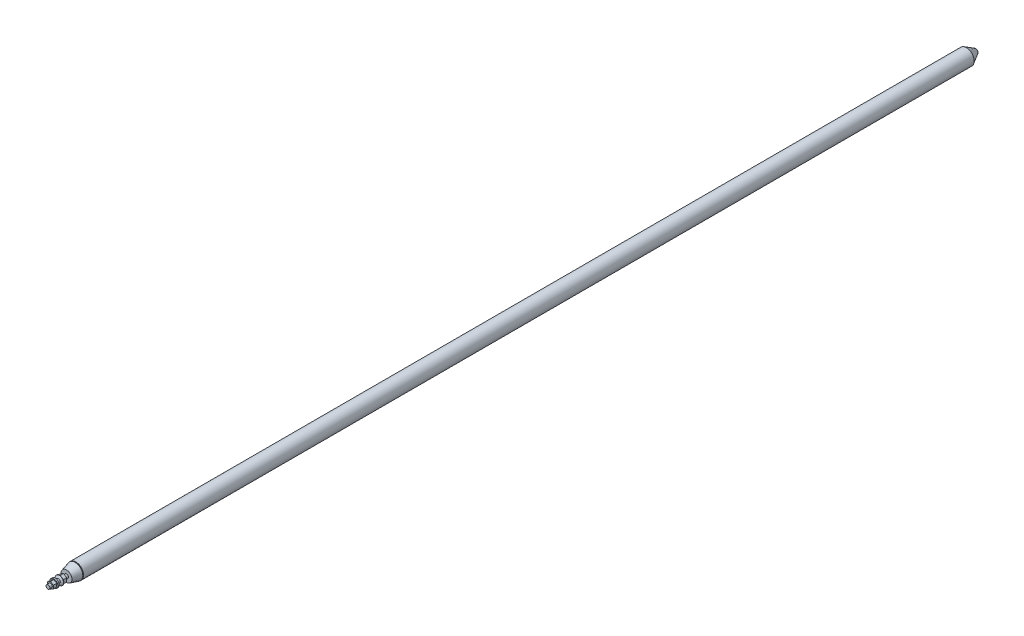
ISO-10303-21;
HEADER;
FILE_DESCRIPTION(('STEP AP214'),'2;1');
FILE_NAME('part.step','',(''),(''),'','','');
FILE_SCHEMA(('AUTOMOTIVE_DESIGN { 1 0 10303 214 1 1 1 1 }'));
ENDSEC;
DATA;
#1=APPLICATION_CONTEXT('core data for automotive mechanical design processes');
#2=APPLICATION_PROTOCOL_DEFINITION('international standard','automotive_design',2000,#1);
#3=PRODUCT_CONTEXT('',#1,'mechanical');
#4=PRODUCT('Part','Part','',(#3));
#5=PRODUCT_RELATED_PRODUCT_CATEGORY('part','',(#4));
#6=PRODUCT_DEFINITION_FORMATION('','',#4);
#7=PRODUCT_DEFINITION_CONTEXT('part definition',#1,'design');
#8=PRODUCT_DEFINITION('design','',#6,#7);
#9=PRODUCT_DEFINITION_SHAPE('','',#8);
#10=(LENGTH_UNIT() NAMED_UNIT(*) SI_UNIT(.MILLI.,.METRE.));
#11=(NAMED_UNIT(*) PLANE_ANGLE_UNIT() SI_UNIT($,.RADIAN.));
#12=(NAMED_UNIT(*) SI_UNIT($,.STERADIAN.) SOLID_ANGLE_UNIT());
#13=UNCERTAINTY_MEASURE_WITH_UNIT(LENGTH_MEASURE(1.E-05),#10,'distance_accuracy_value','');
#14=(GEOMETRIC_REPRESENTATION_CONTEXT(3) GLOBAL_UNCERTAINTY_ASSIGNED_CONTEXT((#13)) GLOBAL_UNIT_ASSIGNED_CONTEXT((#10,
#11,#12)) REPRESENTATION_CONTEXT('',''));
#15=CARTESIAN_POINT('',(0.,0.,0.));
#16=DIRECTION('',(0.,0.,1.));
#17=DIRECTION('',(1.,0.,0.));
#18=AXIS2_PLACEMENT_3D('',#15,#16,#17);
#19=CARTESIAN_POINT('',(0.,16.6751,52.1089983991226));
#20=DIRECTION('',(0.,0.,1.));
#21=DIRECTION('',(1.,0.,0.));
#22=AXIS2_PLACEMENT_3D('',#19,#20,#21);
#23=PLANE('',#22);
#24=CARTESIAN_POINT('',(0.,0.,52.1089983991226));
#25=DIRECTION('',(0.,0.,-1.));
#26=DIRECTION('',(-1.,0.,0.));
#27=AXIS2_PLACEMENT_3D('',#24,#25,#26);
#28=CIRCLE('',#27,16.6751);
#29=CARTESIAN_POINT('',(-16.6751,0.,52.1089983991226));
#30=VERTEX_POINT('',#29);
#31=EDGE_CURVE('E149',#30,#30,#28,.T.);
#32=ORIENTED_EDGE('',*,*,#31,.F.);
#33=EDGE_LOOP('',(#32));
#34=FACE_BOUND('',#33,.T.);
#35=DIRECTION('',(0.866025403784438,0.5,0.));
#36=VECTOR('',#35,1.);
#37=CARTESIAN_POINT('',(0.,-13.7554856334967,52.1089983991226));
#38=LINE('',#37,#36);
#39=CARTESIAN_POINT('',(0.,-13.7554856334967,52.1089983991226));
#40=VERTEX_POINT('',#39);
#41=CARTESIAN_POINT('',(11.9126,-6.87774281674833,52.1089983991226));
#42=VERTEX_POINT('',#41);
#43=EDGE_CURVE('E626',#40,#42,#38,.T.);
#44=ORIENTED_EDGE('',*,*,#43,.F.);
#45=DIRECTION('',(0.866025403784439,-0.499999999999999,0.));
#46=VECTOR('',#45,1.);
#47=CARTESIAN_POINT('',(-11.9126,-6.87774281674834,52.1089983991226));
#48=LINE('',#47,#46);
#49=CARTESIAN_POINT('',(-11.9126,-6.87774281674834,52.1089983991226));
#50=VERTEX_POINT('',#49);
#51=EDGE_CURVE('E147',#50,#40,#48,.T.);
#52=ORIENTED_EDGE('',*,*,#51,.F.);
#53=DIRECTION('',(0.,-1.,0.));
#54=VECTOR('',#53,1.);
#55=CARTESIAN_POINT('',(-11.9126,6.87774281674833,52.1089983991226));
#56=LINE('',#55,#54);
#57=CARTESIAN_POINT('',(-11.9126,6.87774281674833,52.1089983991226));
#58=VERTEX_POINT('',#57);
#59=EDGE_CURVE('E143',#58,#50,#56,.T.);
#60=ORIENTED_EDGE('',*,*,#59,.F.);
#61=DIRECTION('',(-0.866025403784439,-0.5,0.));
#62=VECTOR('',#61,1.);
#63=CARTESIAN_POINT('',(0.,13.7554856334967,52.1089983991226));
#64=LINE('',#63,#62);
#65=CARTESIAN_POINT('',(0.,13.7554856334967,52.1089983991226));
#66=VERTEX_POINT('',#65);
#67=EDGE_CURVE('E622',#66,#58,#64,.T.);
#68=ORIENTED_EDGE('',*,*,#67,.F.);
#69=DIRECTION('',(-0.866025403784439,0.5,0.));
#70=VECTOR('',#69,1.);
#71=CARTESIAN_POINT('',(11.9126,6.87774281674833,52.1089983991226));
#72=LINE('',#71,#70);
#73=CARTESIAN_POINT('',(11.9126,6.87774281674833,52.1089983991226));
#74=VERTEX_POINT('',#73);
#75=EDGE_CURVE('E634',#74,#66,#72,.T.);
#76=ORIENTED_EDGE('',*,*,#75,.F.);
#77=DIRECTION('',(0.,1.,0.));
#78=VECTOR('',#77,1.);
#79=CARTESIAN_POINT('',(11.9126,-6.87774281674833,52.1089983991226));
#80=LINE('',#79,#78);
#81=EDGE_CURVE('E628',#42,#74,#80,.T.);
#82=ORIENTED_EDGE('',*,*,#81,.F.);
#83=EDGE_LOOP('',(#44,#52,#60,#68,#76,#82));
#84=FACE_BOUND('',#83,.T.);
#85=ADVANCED_FACE('F33',(#34,#84),#23,.T.);
#86=CARTESIAN_POINT('',(0.,0.,0.));
#87=DIRECTION('',(0.,0.,-1.));
#88=DIRECTION('',(-1.,0.,0.));
#89=AXIS2_PLACEMENT_3D('',#86,#87,#88);
#90=CYLINDRICAL_SURFACE('',#89,7.93749999999999);
#91=CARTESIAN_POINT('',(0.,0.,46.2923983991226));
#92=DIRECTION('',(0.,0.,-1.));
#93=DIRECTION('',(-1.,0.,0.));
#94=AXIS2_PLACEMENT_3D('',#91,#92,#93);
#95=CIRCLE('',#94,7.93749999999999);
#96=CARTESIAN_POINT('',(-7.93749999999999,0.,46.2923983991226));
#97=VERTEX_POINT('',#96);
#98=EDGE_CURVE('E42',#97,#97,#95,.F.);
#99=ORIENTED_EDGE('',*,*,#98,.F.);
#100=EDGE_LOOP('',(#99));
#101=FACE_BOUND('',#100,.T.);
#102=CARTESIAN_POINT('',(0.,0.,33.5923983991226));
#103=DIRECTION('',(0.,0.,-1.));
#104=DIRECTION('',(-1.,0.,0.));
#105=AXIS2_PLACEMENT_3D('',#102,#103,#104);
#106=CIRCLE('',#105,7.93749999999999);
#107=CARTESIAN_POINT('',(0.,7.93749999999996,33.5923983991227));
#108=VERTEX_POINT('',#107);
#109=EDGE_CURVE('E236',#108,#108,#106,.T.);
#110=ORIENTED_EDGE('',*,*,#109,.F.);
#111=EDGE_LOOP('',(#110));
#112=FACE_BOUND('',#111,.T.);
#113=ADVANCED_FACE('F248',(#101,#112),#90,.T.);
#114=CARTESIAN_POINT('',(0.,0.,0.));
#115=DIRECTION('',(0.,0.,-1.));
#116=DIRECTION('',(-1.,0.,0.));
#117=AXIS2_PLACEMENT_3D('',#114,#115,#116);
#118=CIRCLE('',#117,7.93749999999999);
#119=CARTESIAN_POINT('',(-7.93749999999999,0.,0.));
#120=VERTEX_POINT('',#119);
#121=EDGE_CURVE('E224',#120,#120,#118,.T.);
#122=ORIENTED_EDGE('',*,*,#121,.F.);
#123=EDGE_LOOP('',(#122));
#124=FACE_BOUND('',#123,.T.);
#125=CARTESIAN_POINT('',(0.,0.,12.690475));
#126=DIRECTION('',(0.,0.,1.));
#127=DIRECTION('',(1.,0.,0.));
#128=AXIS2_PLACEMENT_3D('',#125,#126,#127);
#129=CIRCLE('',#128,7.93749999999999);
#130=CARTESIAN_POINT('',(7.93749999999999,0.,12.690475));
#131=VERTEX_POINT('',#130);
#132=EDGE_CURVE('E201',#131,#131,#129,.F.);
#133=ORIENTED_EDGE('',*,*,#132,.T.);
#134=EDGE_LOOP('',(#133));
#135=FACE_BOUND('',#134,.T.);
#136=ADVANCED_FACE('F251',(#124,#135),#90,.T.);
#137=CARTESIAN_POINT('',(0.,0.,-38.1));
#138=DIRECTION('',(0.,0.,1.));
#139=DIRECTION('',(1.,0.,0.));
#140=AXIS2_PLACEMENT_3D('',#137,#138,#139);
#141=CONICAL_SURFACE('',#140,28.575,0.780728808749583);
#142=CARTESIAN_POINT('',(0.,0.,-34.8952102827305));
#143=DIRECTION('',(0.,0.,-1.));
#144=DIRECTION('',(-1.,0.,0.));
#145=AXIS2_PLACEMENT_3D('',#142,#143,#144);
#146=CIRCLE('',#145,31.75);
#147=CARTESIAN_POINT('',(-31.75,0.,-34.8952102827305));
#148=VERTEX_POINT('',#147);
#149=EDGE_CURVE('E230',#148,#148,#146,.T.);
#150=ORIENTED_EDGE('',*,*,#149,.T.);
#151=EDGE_LOOP('',(#150));
#152=FACE_BOUND('',#151,.T.);
#153=CARTESIAN_POINT('',(0.,0.,-38.1));
#154=DIRECTION('',(0.,0.,-1.));
#155=DIRECTION('',(-1.,0.,0.));
#156=AXIS2_PLACEMENT_3D('',#153,#154,#155);
#157=CIRCLE('',#156,28.575);
#158=CARTESIAN_POINT('',(-28.575,0.,-38.1));
#159=VERTEX_POINT('',#158);
#160=EDGE_CURVE('E233',#159,#159,#157,.T.);
#161=ORIENTED_EDGE('',*,*,#160,.F.);
#162=EDGE_LOOP('',(#161));
#163=FACE_BOUND('',#162,.T.);
#164=ADVANCED_FACE('F454',(#152,#163),#141,.T.);
#165=CARTESIAN_POINT('',(0.,0.,-34.8952102827305));
#166=DIRECTION('',(0.,0.,-1.));
#167=DIRECTION('',(-1.,0.,0.));
#168=AXIS2_PLACEMENT_3D('',#165,#166,#167);
#169=CONICAL_SURFACE('',#168,31.75,0.266468742447018);
#170=CARTESIAN_POINT('',(0.,0.,0.));
#171=DIRECTION('',(0.,0.,-1.));
#172=DIRECTION('',(-1.,0.,0.));
#173=AXIS2_PLACEMENT_3D('',#170,#171,#172);
#174=CIRCLE('',#173,22.225);
#175=CARTESIAN_POINT('',(-22.225,0.,0.));
#176=VERTEX_POINT('',#175);
#177=EDGE_CURVE('E227',#176,#176,#174,.T.);
#178=ORIENTED_EDGE('',*,*,#177,.T.);
#179=EDGE_LOOP('',(#178));
#180=FACE_BOUND('',#179,.T.);
#181=ORIENTED_EDGE('',*,*,#149,.F.);
#182=EDGE_LOOP('',(#181));
#183=FACE_BOUND('',#182,.T.);
#184=ADVANCED_FACE('F540',(#180,#183),#169,.T.);
#185=CARTESIAN_POINT('',(0.,7.93749999999999,0.));
#186=DIRECTION('',(0.,0.,1.));
#187=DIRECTION('',(1.,0.,0.));
#188=AXIS2_PLACEMENT_3D('',#185,#186,#187);
#189=PLANE('',#188);
#190=ORIENTED_EDGE('',*,*,#121,.T.);
#191=EDGE_LOOP('',(#190));
#192=FACE_BOUND('',#191,.T.);
#193=ORIENTED_EDGE('',*,*,#177,.F.);
#194=EDGE_LOOP('',(#193));
#195=FACE_BOUND('',#194,.T.);
#196=ADVANCED_FACE('F527',(#192,#195),#189,.T.);
#197=CARTESIAN_POINT('',(0.,31.75,-38.1));
#198=DIRECTION('',(0.,0.,-1.));
#199=DIRECTION('',(-1.,0.,0.));
#200=AXIS2_PLACEMENT_3D('',#197,#198,#199);
#201=PLANE('',#200);
#202=ORIENTED_EDGE('',*,*,#160,.T.);
#203=EDGE_LOOP('',(#202));
#204=FACE_BOUND('',#203,.T.);
#205=CARTESIAN_POINT('',(0.,0.,-38.1));
#206=DIRECTION('',(0.,0.,1.));
#207=DIRECTION('',(1.,0.,0.));
#208=AXIS2_PLACEMENT_3D('',#205,#206,#207);
#209=CIRCLE('',#208,31.75);
#210=CARTESIAN_POINT('',(31.75,0.,-38.1));
#211=VERTEX_POINT('',#210);
#212=EDGE_CURVE('E205',#211,#211,#209,.T.);
#213=ORIENTED_EDGE('',*,*,#212,.T.);
#214=EDGE_LOOP('',(#213));
#215=FACE_BOUND('',#214,.T.);
#216=ADVANCED_FACE('F523',(#204,#215),#201,.F.);
#217=CARTESIAN_POINT('',(0.,0.,29.7434));
#218=DIRECTION('',(0.,0.,1.));
#219=DIRECTION('',(1.,0.,0.));
#220=AXIS2_PLACEMENT_3D('',#217,#218,#219);
#221=CYLINDRICAL_SURFACE('',#220,31.75);
#222=ORIENTED_EDGE('',*,*,#212,.F.);
#223=EDGE_LOOP('',(#222));
#224=FACE_BOUND('',#223,.T.);
#225=CARTESIAN_POINT('',(0.,0.,-3688.58124758295));
#226=DIRECTION('',(0.,0.,1.));
#227=DIRECTION('',(1.,0.,0.));
#228=AXIS2_PLACEMENT_3D('',#225,#226,#227);
#229=CIRCLE('',#228,31.75);
#230=CARTESIAN_POINT('',(31.75,0.,-3688.58124758295));
#231=VERTEX_POINT('',#230);
#232=EDGE_CURVE('E208',#231,#231,#229,.T.);
#233=ORIENTED_EDGE('',*,*,#232,.T.);
#234=EDGE_LOOP('',(#233));
#235=FACE_BOUND('',#234,.T.);
#236=ADVANCED_FACE('F526',(#224,#235),#221,.T.);
#237=CARTESIAN_POINT('',(0.,0.,-3724.52386072327));
#238=DIRECTION('',(0.,0.,1.));
#239=DIRECTION('',(1.,0.,0.));
#240=AXIS2_PLACEMENT_3D('',#237,#238,#239);
#241=CONICAL_SURFACE('',#240,10.9985226280624,0.523598775598293);
#242=ORIENTED_EDGE('',*,*,#232,.F.);
#243=EDGE_LOOP('',(#242));
#244=FACE_BOUND('',#243,.T.);
#245=CARTESIAN_POINT('',(0.,0.,-3724.52386072327));
#246=DIRECTION('',(0.,0.,1.));
#247=DIRECTION('',(1.,0.,0.));
#248=AXIS2_PLACEMENT_3D('',#245,#246,#247);
#249=CIRCLE('',#248,10.9985226280624);
#250=CARTESIAN_POINT('',(10.9985226280624,0.,-3724.52386072327));
#251=VERTEX_POINT('',#250);
#252=EDGE_CURVE('E211',#251,#251,#249,.T.);
#253=ORIENTED_EDGE('',*,*,#252,.T.);
#254=EDGE_LOOP('',(#253));
#255=FACE_BOUND('',#254,.T.);
#256=ADVANCED_FACE('F531',(#244,#255),#241,.T.);
#257=CARTESIAN_POINT('',(0.,0.,-3718.17386072327));
#258=DIRECTION('',(0.,0.,1.));
#259=DIRECTION('',(0.,1.,0.));
#260=AXIS2_PLACEMENT_3D('',#257,#258,#259);
#261=SPHERICAL_SURFACE('',#260,12.7000000000001);
#262=ORIENTED_EDGE('',*,*,#252,.F.);
#263=EDGE_LOOP('',(#262));
#264=FACE_BOUND('',#263,.T.);
#265=ADVANCED_FACE('F464',(#264),#261,.T.);
#266=CARTESIAN_POINT('',(13.5001,-7.79428636908687,12.690475));
#267=DIRECTION('',(-0.499999999999999,0.866025403784439,0.));
#268=DIRECTION('',(-0.866025403784439,-0.5,0.));
#269=AXIS2_PLACEMENT_3D('',#266,#267,#268);
#270=PLANE('',#269);
#271=DIRECTION('',(-0.866025403784439,-0.499999999999999,0.));
#272=VECTOR('',#271,1.);
#273=CARTESIAN_POINT('',(13.5001,-7.79428636908687,28.1686));
#274=LINE('',#273,#272);
#275=CARTESIAN_POINT('',(13.5001,-7.79428636908687,28.1686));
#276=VERTEX_POINT('',#275);
#277=CARTESIAN_POINT('',(0.,-15.5885727381737,28.1686));
#278=VERTEX_POINT('',#277);
#279=EDGE_CURVE('E160',#276,#278,#274,.T.);
#280=ORIENTED_EDGE('',*,*,#279,.T.);
#281=DIRECTION('',(0.,0.,1.));
#282=VECTOR('',#281,1.);
#283=CARTESIAN_POINT('',(0.,-15.5885727381737,12.690475));
#284=LINE('',#283,#282);
#285=CARTESIAN_POINT('',(0.,-15.5885727381737,12.690475));
#286=VERTEX_POINT('',#285);
#287=EDGE_CURVE('E199',#286,#278,#284,.T.);
#288=ORIENTED_EDGE('',*,*,#287,.F.);
#289=DIRECTION('',(-0.866025403784439,-0.499999999999999,0.));
#290=VECTOR('',#289,1.);
#291=CARTESIAN_POINT('',(13.5001,-7.79428636908687,12.690475));
#292=LINE('',#291,#290);
#293=CARTESIAN_POINT('',(13.5001,-7.79428636908687,12.690475));
#294=VERTEX_POINT('',#293);
#295=EDGE_CURVE('E161',#294,#286,#292,.T.);
#296=ORIENTED_EDGE('',*,*,#295,.F.);
#297=DIRECTION('',(0.,0.,1.));
#298=VECTOR('',#297,1.);
#299=CARTESIAN_POINT('',(13.5001,-7.79428636908687,12.690475));
#300=LINE('',#299,#298);
#301=EDGE_CURVE('E175',#294,#276,#300,.T.);
#302=ORIENTED_EDGE('',*,*,#301,.T.);
#303=EDGE_LOOP('',(#280,#288,#296,#302));
#304=FACE_BOUND('',#303,.T.);
#305=ADVANCED_FACE('F292',(#304),#270,.F.);
#306=CARTESIAN_POINT('',(0.,-15.5885727381737,12.690475));
#307=DIRECTION('',(0.5,0.866025403784438,0.));
#308=DIRECTION('',(-0.866025403784438,0.5,0.));
#309=AXIS2_PLACEMENT_3D('',#306,#307,#308);
#310=PLANE('',#309);
#311=DIRECTION('',(-0.866025403784438,0.5,0.));
#312=VECTOR('',#311,1.);
#313=CARTESIAN_POINT('',(0.,-15.5885727381737,28.1686));
#314=LINE('',#313,#312);
#315=CARTESIAN_POINT('',(-13.5001,-7.79428636908686,28.1686));
#316=VERTEX_POINT('',#315);
#317=EDGE_CURVE('E178',#278,#316,#314,.T.);
#318=ORIENTED_EDGE('',*,*,#317,.T.);
#319=DIRECTION('',(0.,0.,1.));
#320=VECTOR('',#319,1.);
#321=CARTESIAN_POINT('',(-13.5001,-7.79428636908686,12.690475));
#322=LINE('',#321,#320);
#323=CARTESIAN_POINT('',(-13.5001,-7.79428636908686,12.690475));
#324=VERTEX_POINT('',#323);
#325=EDGE_CURVE('E196',#324,#316,#322,.T.);
#326=ORIENTED_EDGE('',*,*,#325,.F.);
#327=DIRECTION('',(-0.866025403784438,0.5,0.));
#328=VECTOR('',#327,1.);
#329=CARTESIAN_POINT('',(0.,-15.5885727381737,12.690475));
#330=LINE('',#329,#328);
#331=EDGE_CURVE('E164',#286,#324,#330,.T.);
#332=ORIENTED_EDGE('',*,*,#331,.F.);
#333=ORIENTED_EDGE('',*,*,#287,.T.);
#334=EDGE_LOOP('',(#318,#326,#332,#333));
#335=FACE_BOUND('',#334,.T.);
#336=ADVANCED_FACE('F280',(#335),#310,.F.);
#337=CARTESIAN_POINT('',(-13.5001,-7.79428636908686,12.690475));
#338=DIRECTION('',(1.,0.,0.));
#339=DIRECTION('',(0.,1.,0.));
#340=AXIS2_PLACEMENT_3D('',#337,#338,#339);
#341=PLANE('',#340);
#342=DIRECTION('',(0.,1.,0.));
#343=VECTOR('',#342,1.);
#344=CARTESIAN_POINT('',(-13.5001,-7.79428636908686,28.1686));
#345=LINE('',#344,#343);
#346=CARTESIAN_POINT('',(-13.5001,7.79428636908686,28.1686));
#347=VERTEX_POINT('',#346);
#348=EDGE_CURVE('E180',#316,#347,#345,.T.);
#349=ORIENTED_EDGE('',*,*,#348,.T.);
#350=DIRECTION('',(0.,0.,1.));
#351=VECTOR('',#350,1.);
#352=CARTESIAN_POINT('',(-13.5001,7.79428636908686,12.690475));
#353=LINE('',#352,#351);
#354=CARTESIAN_POINT('',(-13.5001,7.79428636908686,12.690475));
#355=VERTEX_POINT('',#354);
#356=EDGE_CURVE('E193',#355,#347,#353,.T.);
#357=ORIENTED_EDGE('',*,*,#356,.F.);
#358=DIRECTION('',(0.,1.,0.));
#359=VECTOR('',#358,1.);
#360=CARTESIAN_POINT('',(-13.5001,-7.79428636908686,12.690475));
#361=LINE('',#360,#359);
#362=EDGE_CURVE('E167',#324,#355,#361,.T.);
#363=ORIENTED_EDGE('',*,*,#362,.F.);
#364=ORIENTED_EDGE('',*,*,#325,.T.);
#365=EDGE_LOOP('',(#349,#357,#363,#364));
#366=FACE_BOUND('',#365,.T.);
#367=ADVANCED_FACE('F284',(#366),#341,.F.);
#368=CARTESIAN_POINT('',(-13.5001,7.79428636908686,12.690475));
#369=DIRECTION('',(0.5,-0.866025403784439,0.));
#370=DIRECTION('',(0.866025403784439,0.5,0.));
#371=AXIS2_PLACEMENT_3D('',#368,#369,#370);
#372=PLANE('',#371);
#373=DIRECTION('',(0.866025403784439,0.5,0.));
#374=VECTOR('',#373,1.);
#375=CARTESIAN_POINT('',(-13.5001,7.79428636908686,28.1686));
#376=LINE('',#375,#374);
#377=CARTESIAN_POINT('',(0.,15.5885727381737,28.1686));
#378=VERTEX_POINT('',#377);
#379=EDGE_CURVE('E182',#347,#378,#376,.T.);
#380=ORIENTED_EDGE('',*,*,#379,.T.);
#381=DIRECTION('',(0.,0.,1.));
#382=VECTOR('',#381,1.);
#383=CARTESIAN_POINT('',(0.,15.5885727381737,12.690475));
#384=LINE('',#383,#382);
#385=CARTESIAN_POINT('',(0.,15.5885727381737,12.690475));
#386=VERTEX_POINT('',#385);
#387=EDGE_CURVE('E190',#386,#378,#384,.T.);
#388=ORIENTED_EDGE('',*,*,#387,.F.);
#389=DIRECTION('',(0.866025403784439,0.5,0.));
#390=VECTOR('',#389,1.);
#391=CARTESIAN_POINT('',(-13.5001,7.79428636908686,12.690475));
#392=LINE('',#391,#390);
#393=EDGE_CURVE('E169',#355,#386,#392,.T.);
#394=ORIENTED_EDGE('',*,*,#393,.F.);
#395=ORIENTED_EDGE('',*,*,#356,.T.);
#396=EDGE_LOOP('',(#380,#388,#394,#395));
#397=FACE_BOUND('',#396,.T.);
#398=ADVANCED_FACE('F299',(#397),#372,.F.);
#399=CARTESIAN_POINT('',(0.,15.5885727381737,12.690475));
#400=DIRECTION('',(-0.5,-0.866025403784438,0.));
#401=DIRECTION('',(0.866025403784439,-0.5,0.));
#402=AXIS2_PLACEMENT_3D('',#399,#400,#401);
#403=PLANE('',#402);
#404=DIRECTION('',(0.866025403784438,-0.5,0.));
#405=VECTOR('',#404,1.);
#406=CARTESIAN_POINT('',(0.,15.5885727381737,28.1686));
#407=LINE('',#406,#405);
#408=CARTESIAN_POINT('',(13.5001,7.79428636908686,28.1686));
#409=VERTEX_POINT('',#408);
#410=EDGE_CURVE('E184',#378,#409,#407,.T.);
#411=ORIENTED_EDGE('',*,*,#410,.T.);
#412=DIRECTION('',(0.,0.,1.));
#413=VECTOR('',#412,1.);
#414=CARTESIAN_POINT('',(13.5001,7.79428636908686,12.690475));
#415=LINE('',#414,#413);
#416=CARTESIAN_POINT('',(13.5001,7.79428636908686,12.690475));
#417=VERTEX_POINT('',#416);
#418=EDGE_CURVE('E57',#417,#409,#415,.T.);
#419=ORIENTED_EDGE('',*,*,#418,.F.);
#420=DIRECTION('',(0.866025403784438,-0.5,0.));
#421=VECTOR('',#420,1.);
#422=CARTESIAN_POINT('',(0.,15.5885727381737,12.690475));
#423=LINE('',#422,#421);
#424=EDGE_CURVE('E171',#386,#417,#423,.T.);
#425=ORIENTED_EDGE('',*,*,#424,.F.);
#426=ORIENTED_EDGE('',*,*,#387,.T.);
#427=EDGE_LOOP('',(#411,#419,#425,#426));
#428=FACE_BOUND('',#427,.T.);
#429=ADVANCED_FACE('F296',(#428),#403,.F.);
#430=CARTESIAN_POINT('',(13.5001,7.79428636908686,12.690475));
#431=DIRECTION('',(-1.,0.,0.));
#432=DIRECTION('',(0.,0.,1.));
#433=AXIS2_PLACEMENT_3D('',#430,#431,#432);
#434=PLANE('',#433);
#435=DIRECTION('',(0.,-1.,0.));
#436=VECTOR('',#435,1.);
#437=CARTESIAN_POINT('',(13.5001,7.79428636908686,28.1686));
#438=LINE('',#437,#436);
#439=EDGE_CURVE('E165',#409,#276,#438,.T.);
#440=ORIENTED_EDGE('',*,*,#439,.T.);
#441=ORIENTED_EDGE('',*,*,#301,.F.);
#442=DIRECTION('',(0.,-1.,0.));
#443=VECTOR('',#442,1.);
#444=CARTESIAN_POINT('',(13.5001,7.79428636908686,12.690475));
#445=LINE('',#444,#443);
#446=EDGE_CURVE('E173',#417,#294,#445,.T.);
#447=ORIENTED_EDGE('',*,*,#446,.F.);
#448=ORIENTED_EDGE('',*,*,#418,.T.);
#449=EDGE_LOOP('',(#440,#441,#447,#448));
#450=FACE_BOUND('',#449,.T.);
#451=ADVANCED_FACE('F293',(#450),#434,.F.);
#452=CARTESIAN_POINT('',(13.5001,-7.79428636908687,12.690475));
#453=DIRECTION('',(0.,0.,1.));
#454=DIRECTION('',(1.,0.,0.));
#455=AXIS2_PLACEMENT_3D('',#452,#453,#454);
#456=PLANE('',#455);
#457=ORIENTED_EDGE('',*,*,#132,.F.);
#458=EDGE_LOOP('',(#457));
#459=FACE_BOUND('',#458,.T.);
#460=ORIENTED_EDGE('',*,*,#295,.T.);
#461=ORIENTED_EDGE('',*,*,#331,.T.);
#462=ORIENTED_EDGE('',*,*,#362,.T.);
#463=ORIENTED_EDGE('',*,*,#393,.T.);
#464=ORIENTED_EDGE('',*,*,#424,.T.);
#465=ORIENTED_EDGE('',*,*,#446,.T.);
#466=EDGE_LOOP('',(#460,#461,#462,#463,#464,#465));
#467=FACE_BOUND('',#466,.T.);
#468=ADVANCED_FACE('F260',(#459,#467),#456,.F.);
#469=CARTESIAN_POINT('',(0.,0.,0.0435161764705885));
#470=DIRECTION('',(0.,0.,-1.));
#471=DIRECTION('',(0.,1.,0.));
#472=AXIS2_PLACEMENT_3D('',#469,#470,#471);
#473=SPHERICAL_SURFACE('',#472,34.4750838235294);
#474=CARTESIAN_POINT('',(0.,0.,29.7688));
#475=DIRECTION('',(0.,0.,-1.));
#476=DIRECTION('',(-1.,0.,0.));
#477=AXIS2_PLACEMENT_3D('',#474,#475,#476);
#478=CIRCLE('',#477,17.4625);
#479=CARTESIAN_POINT('',(0.,17.4625,29.7688));
#480=VERTEX_POINT('',#479);
#481=EDGE_CURVE('E215',#480,#480,#478,.T.);
#482=CARTESIAN_POINT('',(0.,7.93749999999996,33.5923983991227));
#483=CARTESIAN_POINT('',(0.,8.04193033230631,33.5676907138939));
#484=CARTESIAN_POINT('',(0.,8.14624529277318,33.5424953955937));
#485=CARTESIAN_POINT('',(0.,8.35463538983752,33.4911317569022));
#486=CARTESIAN_POINT('',(0.,8.458710526435,33.464963436511));
#487=CARTESIAN_POINT('',(0.,8.66661189557016,33.4116560576896));
#488=CARTESIAN_POINT('',(0.,8.77043812810784,33.3845169992594));
#489=CARTESIAN_POINT('',(0.,8.97783263624223,33.3292705157999));
#490=CARTESIAN_POINT('',(0.,9.08140091183892,33.3011630907704));
#491=CARTESIAN_POINT('',(0.,9.28827047420351,33.2439823239056));
#492=CARTESIAN_POINT('',(0.,9.39157176097139,33.2149089820701));
#493=CARTESIAN_POINT('',(0.,9.59789833747534,33.1557989172506));
#494=CARTESIAN_POINT('',(0.,9.7009236272114,33.1257621942665));
#495=CARTESIAN_POINT('',(0.,9.90668922540895,33.0647279863804));
#496=CARTESIAN_POINT('',(0.,10.0094295338704,33.0337305014784));
#497=CARTESIAN_POINT('',(0.,10.2146162101565,32.9707774728867));
#498=CARTESIAN_POINT('',(0.,10.3170625779811,32.938821929197));
#499=CARTESIAN_POINT('',(0.,10.521652439256,32.8739555696753));
#500=CARTESIAN_POINT('',(0.,10.6237959327063,32.8410447538433));
#501=CARTESIAN_POINT('',(0.,10.8277711379095,32.7742707199945));
#502=CARTESIAN_POINT('',(0.,10.9296028496623,32.7404075019776));
#503=CARTESIAN_POINT('',(0.,11.132945611335,32.6717316167674));
#504=CARTESIAN_POINT('',(0.,11.234456661255,32.636918949574));
#505=CARTESIAN_POINT('',(0.,11.4371492470899,32.5663472018157));
#506=CARTESIAN_POINT('',(0.,11.5383307830049,32.5305881212508));
#507=CARTESIAN_POINT('',(0.,11.7403555173927,32.458126665085));
#508=CARTESIAN_POINT('',(0.,11.8411987158655,32.4214242894841));
#509=CARTESIAN_POINT('',(0.,12.042537981436,32.3470794438415));
#510=CARTESIAN_POINT('',(0.,12.1430340485337,32.3094369737997));
#511=CARTESIAN_POINT('',(0.,12.3436702876927,32.2332152218499));
#512=CARTESIAN_POINT('',(0.,12.4438104597538,32.194635939942));
#513=CARTESIAN_POINT('',(0.,12.6437261762134,32.1165439285288));
#514=CARTESIAN_POINT('',(0.,12.7435017206118,32.0770311990235));
#515=CARTESIAN_POINT('',(0.,12.9426794809169,31.9970757380846));
#516=CARTESIAN_POINT('',(0.,13.0420816968236,31.956633006651));
#517=CARTESIAN_POINT('',(0.,13.2405041318717,31.8748210686243));
#518=CARTESIAN_POINT('',(0.,13.3395243510132,31.8334518620313));
#519=CARTESIAN_POINT('',(0.,13.5371741575694,31.7497905812473));
#520=CARTESIAN_POINT('',(0.,13.6358037449841,31.7074985070563));
#521=CARTESIAN_POINT('',(0.,13.8326636871895,31.6219951791153));
#522=CARTESIAN_POINT('',(0.,13.9308940419803,31.5787839253653));
#523=CARTESIAN_POINT('',(0.,14.1269469528556,31.4914460065018));
#524=CARTESIAN_POINT('',(0.,14.2247695089402,31.4473193413882));
#525=CARTESIAN_POINT('',(0.,14.4199982918825,31.3581544478201));
#526=CARTESIAN_POINT('',(0.,14.5174045187402,31.3131162193657));
#527=CARTESIAN_POINT('',(0.,14.7117921490136,31.2221321266308));
#528=CARTESIAN_POINT('',(0.,14.8087735524293,31.1761862623503));
#529=CARTESIAN_POINT('',(0.,15.0023030786502,31.0833909046278));
#530=CARTESIAN_POINT('',(0.,15.0988512014553,31.0365414111859));
#531=CARTESIAN_POINT('',(0.,15.2915057470694,30.9419428806036));
#532=CARTESIAN_POINT('',(0.,15.3876121698782,30.8941938434631));
#533=CARTESIAN_POINT('',(0.,15.579374934636,30.7978003893978));
#534=CARTESIAN_POINT('',(0.,15.675031276585,30.749155972473));
#535=CARTESIAN_POINT('',(0.,15.8658855379922,30.6509760008058));
#536=CARTESIAN_POINT('',(0.,15.9610834574505,30.6014404460634));
#537=CARTESIAN_POINT('',(0.,16.1510125722821,30.5014825185434));
#538=CARTESIAN_POINT('',(0.,16.2457437676554,30.4510601457658));
#539=CARTESIAN_POINT('',(0.,16.4347311731984,30.3493329789012));
#540=CARTESIAN_POINT('',(0.,16.5289873833681,30.2980281848143));
#541=CARTESIAN_POINT('',(0.,16.7170165996438,30.194540650465));
#542=CARTESIAN_POINT('',(0.,16.8107896057498,30.1423579102026));
#543=CARTESIAN_POINT('',(0.,16.9978442340481,30.0371190297578));
#544=CARTESIAN_POINT('',(0.,17.0911258562404,29.9840628895754));
#545=CARTESIAN_POINT('',(0.,17.2771895913833,29.877081852009));
#546=CARTESIAN_POINT('',(0.,17.369971704334,29.8231569546252));
#547=CARTESIAN_POINT('',(0.,17.4625,29.7688));
#548=B_SPLINE_CURVE_WITH_KNOTS('',3,(#482,#483,#484,#485,#486,#487,#488,#489,#490,#491,#492,
#493,#494,#495,#496,#497,#498,#499,#500,#501,#502,#503,#504,#505,#506,#507,#508,#509,#510,#511,
#512,#513,#514,#515,#516,#517,#518,#519,#520,#521,#522,#523,#524,#525,#526,#527,#528,#529,#530,
#531,#532,#533,#534,#535,#536,#537,#538,#539,#540,#541,#542,#543,#544,#545,#546,#547),
.UNSPECIFIED.,.F.,.F.,(4,2,2,2,2,2,2,2,2,2,2,2,2,2,2,2,2,2,2,2,2,2,2,2,2,2,2,2,2,2,2,2,4),(0.,
0.321939004572816,0.643878009145632,0.965817013718447,1.28775601829126,1.60969502286408,
1.9316340274369,2.25357303200971,2.57551203658253,2.89745104115534,3.21939004572815,
3.54132905030097,3.86326805487378,4.1852070594466,4.50714606401941,4.82908506859223,
5.15102407316505,5.47296307773786,5.79490208231068,6.11684108688349,6.43878009145631,
6.76071909602913,7.08265810060194,7.40459710517475,7.72653610974757,8.04847511432038,
8.3704141188932,8.69235312346602,9.01429212803883,9.33623113261165,9.65817013718446,
9.98010914175728,10.3020481463301),.UNSPECIFIED.);
#549=EDGE_CURVE('BSEAM256',#108,#480,#548,.T.);
#550=ORIENTED_EDGE('',*,*,#109,.T.);
#551=ORIENTED_EDGE('',*,*,#481,.F.);
#552=ORIENTED_EDGE('',*,*,#549,.T.);
#553=ORIENTED_EDGE('',*,*,#549,.F.);
#554=EDGE_LOOP('',(#550,#552,#551,#553));
#555=FACE_BOUND('',#554,.T.);
#556=ADVANCED_FACE('F256',(#555),#473,.T.);
#557=CARTESIAN_POINT('',(0.,0.,0.));
#558=DIRECTION('',(0.,0.,-1.));
#559=DIRECTION('',(-1.,0.,0.));
#560=AXIS2_PLACEMENT_3D('',#557,#558,#559);
#561=CYLINDRICAL_SURFACE('',#560,17.4625);
#562=ORIENTED_EDGE('',*,*,#481,.T.);
#563=EDGE_LOOP('',(#562));
#564=FACE_BOUND('',#563,.T.);
#565=CARTESIAN_POINT('',(0.,0.,28.1686));
#566=DIRECTION('',(0.,0.,-1.));
#567=DIRECTION('',(-1.,0.,0.));
#568=AXIS2_PLACEMENT_3D('',#565,#566,#567);
#569=CIRCLE('',#568,17.4625);
#570=CARTESIAN_POINT('',(-17.4625,0.,28.1686));
#571=VERTEX_POINT('',#570);
#572=EDGE_CURVE('E218',#571,#571,#569,.T.);
#573=ORIENTED_EDGE('',*,*,#572,.F.);
#574=EDGE_LOOP('',(#573));
#575=FACE_BOUND('',#574,.T.);
#576=ADVANCED_FACE('F259',(#564,#575),#561,.T.);
#577=CARTESIAN_POINT('',(0.,0.,28.1686));
#578=DIRECTION('',(0.,0.,-1.));
#579=DIRECTION('',(-1.,0.,0.));
#580=AXIS2_PLACEMENT_3D('',#577,#578,#579);
#581=PLANE('',#580);
#582=ORIENTED_EDGE('',*,*,#572,.T.);
#583=EDGE_LOOP('',(#582));
#584=FACE_BOUND('',#583,.T.);
#585=ORIENTED_EDGE('',*,*,#317,.F.);
#586=ORIENTED_EDGE('',*,*,#279,.F.);
#587=ORIENTED_EDGE('',*,*,#439,.F.);
#588=ORIENTED_EDGE('',*,*,#410,.F.);
#589=ORIENTED_EDGE('',*,*,#379,.F.);
#590=ORIENTED_EDGE('',*,*,#348,.F.);
#591=EDGE_LOOP('',(#585,#586,#587,#588,#589,#590));
#592=FACE_BOUND('',#591,.T.);
#593=ADVANCED_FACE('F266',(#584,#592),#581,.T.);
#594=CARTESIAN_POINT('',(0.,0.,46.2923983991226));
#595=DIRECTION('',(0.,0.,-1.));
#596=DIRECTION('',(-1.,0.,0.));
#597=AXIS2_PLACEMENT_3D('',#594,#595,#596);
#598=PLANE('',#597);
#599=ORIENTED_EDGE('',*,*,#98,.T.);
#600=EDGE_LOOP('',(#599));
#601=FACE_BOUND('',#600,.T.);
#602=CARTESIAN_POINT('',(0.,0.,46.2923983991226));
#603=DIRECTION('',(0.,0.,-1.));
#604=DIRECTION('',(-1.,0.,0.));
#605=AXIS2_PLACEMENT_3D('',#602,#603,#604);
#606=CIRCLE('',#605,16.6751);
#607=CARTESIAN_POINT('',(-16.6751,0.,46.2923983991226));
#608=VERTEX_POINT('',#607);
#609=EDGE_CURVE('E152',#608,#608,#606,.T.);
#610=ORIENTED_EDGE('',*,*,#609,.T.);
#611=EDGE_LOOP('',(#610));
#612=FACE_BOUND('',#611,.T.);
#613=ADVANCED_FACE('F245',(#601,#612),#598,.T.);
#614=CARTESIAN_POINT('',(0.,0.,0.));
#615=DIRECTION('',(0.,0.,-1.));
#616=DIRECTION('',(-1.,0.,0.));
#617=AXIS2_PLACEMENT_3D('',#614,#615,#616);
#618=CYLINDRICAL_SURFACE('',#617,16.6751);
#619=ORIENTED_EDGE('',*,*,#31,.T.);
#620=EDGE_LOOP('',(#619));
#621=FACE_BOUND('',#620,.T.);
#622=ORIENTED_EDGE('',*,*,#609,.F.);
#623=EDGE_LOOP('',(#622));
#624=FACE_BOUND('',#623,.T.);
#625=ADVANCED_FACE('F318',(#621,#624),#618,.T.);
#626=CARTESIAN_POINT('',(-11.9126,-6.87774281674834,65.9996233991226));
#627=DIRECTION('',(0.499999999999999,0.866025403784439,0.));
#628=DIRECTION('',(-0.866025403784439,0.499999999999999,0.));
#629=AXIS2_PLACEMENT_3D('',#626,#627,#628);
#630=PLANE('',#629);
#631=ORIENTED_EDGE('',*,*,#51,.T.);
#632=DIRECTION('',(0.,0.,-1.));
#633=VECTOR('',#632,1.);
#634=CARTESIAN_POINT('',(0.,-13.7554856334967,65.9996233991226));
#635=LINE('',#634,#633);
#636=CARTESIAN_POINT('',(0.,-13.7554856334967,65.9996233991226));
#637=VERTEX_POINT('',#636);
#638=EDGE_CURVE('E128',#637,#40,#635,.T.);
#639=ORIENTED_EDGE('',*,*,#638,.F.);
#640=DIRECTION('',(0.866025403784439,-0.499999999999999,0.));
#641=VECTOR('',#640,1.);
#642=CARTESIAN_POINT('',(-11.9126,-6.87774281674834,65.9996233991226));
#643=LINE('',#642,#641);
#644=CARTESIAN_POINT('',(-11.9126,-6.87774281674834,65.9996233991226));
#645=VERTEX_POINT('',#644);
#646=EDGE_CURVE('E135',#645,#637,#643,.T.);
#647=ORIENTED_EDGE('',*,*,#646,.F.);
#648=DIRECTION('',(0.,0.,-1.));
#649=VECTOR('',#648,1.);
#650=CARTESIAN_POINT('',(-11.9126,-6.87774281674834,65.9996233991226));
#651=LINE('',#650,#649);
#652=EDGE_CURVE('E620',#645,#50,#651,.T.);
#653=ORIENTED_EDGE('',*,*,#652,.T.);
#654=EDGE_LOOP('',(#631,#639,#647,#653));
#655=FACE_BOUND('',#654,.T.);
#656=ADVANCED_FACE('F145',(#655),#630,.F.);
#657=CARTESIAN_POINT('',(0.,-13.7554856334967,65.9996233991226));
#658=DIRECTION('',(-0.5,0.866025403784438,0.));
#659=DIRECTION('',(-0.866025403784438,-0.5,0.));
#660=AXIS2_PLACEMENT_3D('',#657,#658,#659);
#661=PLANE('',#660);
#662=ORIENTED_EDGE('',*,*,#43,.T.);
#663=DIRECTION('',(0.,0.,-1.));
#664=VECTOR('',#663,1.);
#665=CARTESIAN_POINT('',(11.9126,-6.87774281674833,65.9996233991226));
#666=LINE('',#665,#664);
#667=CARTESIAN_POINT('',(11.9126,-6.87774281674833,65.9996233991226));
#668=VERTEX_POINT('',#667);
#669=EDGE_CURVE('E131',#668,#42,#666,.T.);
#670=ORIENTED_EDGE('',*,*,#669,.F.);
#671=DIRECTION('',(0.866025403784438,0.5,0.));
#672=VECTOR('',#671,1.);
#673=CARTESIAN_POINT('',(0.,-13.7554856334967,65.9996233991226));
#674=LINE('',#673,#672);
#675=EDGE_CURVE('E124',#637,#668,#674,.T.);
#676=ORIENTED_EDGE('',*,*,#675,.F.);
#677=ORIENTED_EDGE('',*,*,#638,.T.);
#678=EDGE_LOOP('',(#662,#670,#676,#677));
#679=FACE_BOUND('',#678,.T.);
#680=ADVANCED_FACE('F126',(#679),#661,.F.);
#681=CARTESIAN_POINT('',(11.9126,-6.87774281674833,65.9996233991226));
#682=DIRECTION('',(-1.,0.,0.));
#683=DIRECTION('',(0.,-1.,0.));
#684=AXIS2_PLACEMENT_3D('',#681,#682,#683);
#685=PLANE('',#684);
#686=ORIENTED_EDGE('',*,*,#81,.T.);
#687=DIRECTION('',(0.,0.,-1.));
#688=VECTOR('',#687,1.);
#689=CARTESIAN_POINT('',(11.9126,6.87774281674833,65.9996233991226));
#690=LINE('',#689,#688);
#691=CARTESIAN_POINT('',(11.9126,6.87774281674833,65.9996233991226));
#692=VERTEX_POINT('',#691);
#693=EDGE_CURVE('E154',#692,#74,#690,.T.);
#694=ORIENTED_EDGE('',*,*,#693,.F.);
#695=DIRECTION('',(0.,1.,0.));
#696=VECTOR('',#695,1.);
#697=CARTESIAN_POINT('',(11.9126,-6.87774281674833,65.9996233991226));
#698=LINE('',#697,#696);
#699=EDGE_CURVE('E134',#668,#692,#698,.T.);
#700=ORIENTED_EDGE('',*,*,#699,.F.);
#701=ORIENTED_EDGE('',*,*,#669,.T.);
#702=EDGE_LOOP('',(#686,#694,#700,#701));
#703=FACE_BOUND('',#702,.T.);
#704=ADVANCED_FACE('F370',(#703),#685,.F.);
#705=CARTESIAN_POINT('',(11.9126,6.87774281674833,65.9996233991226));
#706=DIRECTION('',(-0.5,-0.866025403784439,0.));
#707=DIRECTION('',(0.866025403784439,-0.5,0.));
#708=AXIS2_PLACEMENT_3D('',#705,#706,#707);
#709=PLANE('',#708);
#710=ORIENTED_EDGE('',*,*,#75,.T.);
#711=DIRECTION('',(0.,0.,-1.));
#712=VECTOR('',#711,1.);
#713=CARTESIAN_POINT('',(0.,13.7554856334967,65.9996233991226));
#714=LINE('',#713,#712);
#715=CARTESIAN_POINT('',(0.,13.7554856334967,65.9996233991226));
#716=VERTEX_POINT('',#715);
#717=EDGE_CURVE('E638',#716,#66,#714,.T.);
#718=ORIENTED_EDGE('',*,*,#717,.F.);
#719=DIRECTION('',(-0.866025403784439,0.5,0.));
#720=VECTOR('',#719,1.);
#721=CARTESIAN_POINT('',(11.9126,6.87774281674833,65.9996233991226));
#722=LINE('',#721,#720);
#723=EDGE_CURVE('E645',#692,#716,#722,.T.);
#724=ORIENTED_EDGE('',*,*,#723,.F.);
#725=ORIENTED_EDGE('',*,*,#693,.T.);
#726=EDGE_LOOP('',(#710,#718,#724,#725));
#727=FACE_BOUND('',#726,.T.);
#728=ADVANCED_FACE('F376',(#727),#709,.F.);
#729=CARTESIAN_POINT('',(0.,13.7554856334967,65.9996233991226));
#730=DIRECTION('',(0.5,-0.866025403784439,0.));
#731=DIRECTION('',(0.866025403784439,0.5,0.));
#732=AXIS2_PLACEMENT_3D('',#729,#730,#731);
#733=PLANE('',#732);
#734=ORIENTED_EDGE('',*,*,#67,.T.);
#735=DIRECTION('',(0.,0.,-1.));
#736=VECTOR('',#735,1.);
#737=CARTESIAN_POINT('',(-11.9126,6.87774281674833,65.9996233991226));
#738=LINE('',#737,#736);
#739=CARTESIAN_POINT('',(-11.9126,6.87774281674833,65.9996233991226));
#740=VERTEX_POINT('',#739);
#741=EDGE_CURVE('E49',#740,#58,#738,.T.);
#742=ORIENTED_EDGE('',*,*,#741,.F.);
#743=DIRECTION('',(-0.866025403784439,-0.5,0.));
#744=VECTOR('',#743,1.);
#745=CARTESIAN_POINT('',(0.,13.7554856334967,65.9996233991226));
#746=LINE('',#745,#744);
#747=EDGE_CURVE('E647',#716,#740,#746,.T.);
#748=ORIENTED_EDGE('',*,*,#747,.F.);
#749=ORIENTED_EDGE('',*,*,#717,.T.);
#750=EDGE_LOOP('',(#734,#742,#748,#749));
#751=FACE_BOUND('',#750,.T.);
#752=ADVANCED_FACE('F384',(#751),#733,.F.);
#753=CARTESIAN_POINT('',(-11.9126,6.87774281674833,65.9996233991226));
#754=DIRECTION('',(1.,0.,0.));
#755=DIRECTION('',(0.,1.,0.));
#756=AXIS2_PLACEMENT_3D('',#753,#754,#755);
#757=PLANE('',#756);
#758=ORIENTED_EDGE('',*,*,#59,.T.);
#759=ORIENTED_EDGE('',*,*,#652,.F.);
#760=DIRECTION('',(0.,-1.,0.));
#761=VECTOR('',#760,1.);
#762=CARTESIAN_POINT('',(-11.9126,6.87774281674833,65.9996233991226));
#763=LINE('',#762,#761);
#764=EDGE_CURVE('E139',#740,#645,#763,.T.);
#765=ORIENTED_EDGE('',*,*,#764,.F.);
#766=ORIENTED_EDGE('',*,*,#741,.T.);
#767=EDGE_LOOP('',(#758,#759,#765,#766));
#768=FACE_BOUND('',#767,.T.);
#769=ADVANCED_FACE('F392',(#768),#757,.F.);
#770=CARTESIAN_POINT('',(11.9126,-20.633228450245,65.9996233991226));
#771=DIRECTION('',(0.,0.,1.));
#772=DIRECTION('',(1.,0.,0.));
#773=AXIS2_PLACEMENT_3D('',#770,#771,#772);
#774=PLANE('',#773);
#775=CARTESIAN_POINT('',(0.,0.,65.9996233991226));
#776=DIRECTION('',(0.,0.,1.));
#777=DIRECTION('',(1.,0.,0.));
#778=AXIS2_PLACEMENT_3D('',#775,#776,#777);
#779=CIRCLE('',#778,7.93749999999999);
#780=CARTESIAN_POINT('',(7.93749999999999,0.,65.9996233991226));
#781=VERTEX_POINT('',#780);
#782=EDGE_CURVE('E11',#781,#781,#779,.F.);
#783=ORIENTED_EDGE('',*,*,#782,.T.);
#784=EDGE_LOOP('',(#783));
#785=FACE_BOUND('',#784,.T.);
#786=ORIENTED_EDGE('',*,*,#646,.T.);
#787=ORIENTED_EDGE('',*,*,#675,.T.);
#788=ORIENTED_EDGE('',*,*,#699,.T.);
#789=ORIENTED_EDGE('',*,*,#723,.T.);
#790=ORIENTED_EDGE('',*,*,#747,.T.);
#791=ORIENTED_EDGE('',*,*,#764,.T.);
#792=EDGE_LOOP('',(#786,#787,#788,#789,#790,#791));
#793=FACE_BOUND('',#792,.T.);
#794=ADVANCED_FACE('F138',(#785,#793),#774,.T.);
#795=CARTESIAN_POINT('',(0.,0.,76.2));
#796=DIRECTION('',(0.,0.,1.));
#797=DIRECTION('',(1.,0.,0.));
#798=AXIS2_PLACEMENT_3D('',#795,#796,#797);
#799=PLANE('',#798);
#800=CARTESIAN_POINT('',(0.,0.,76.2));
#801=DIRECTION('',(0.,0.,-1.));
#802=DIRECTION('',(-1.,0.,0.));
#803=AXIS2_PLACEMENT_3D('',#800,#801,#802);
#804=CIRCLE('',#803,7.93749999999999);
#805=CARTESIAN_POINT('',(-7.93749999999999,0.,76.2));
#806=VERTEX_POINT('',#805);
#807=EDGE_CURVE('E221',#806,#806,#804,.T.);
#808=ORIENTED_EDGE('',*,*,#807,.F.);
#809=EDGE_LOOP('',(#808));
#810=FACE_BOUND('',#809,.T.);
#811=ADVANCED_FACE('F406',(#810),#799,.T.);
#812=ORIENTED_EDGE('',*,*,#782,.F.);
#813=EDGE_LOOP('',(#812));
#814=FACE_BOUND('',#813,.T.);
#815=ORIENTED_EDGE('',*,*,#807,.T.);
#816=EDGE_LOOP('',(#815));
#817=FACE_BOUND('',#816,.T.);
#818=ADVANCED_FACE('F253',(#814,#817),#90,.T.);
#819=CLOSED_SHELL('',(#85,#113,#136,#164,#184,#196,#216,#236,#256,#265,#305,#336,#367,#398,#429,
#451,#468,#556,#576,#593,#613,#625,#656,#680,#704,#728,#752,#769,#794,#811,#818));
#820=CARTESIAN_POINT('',(0.,28.575,-47.625));
#821=DIRECTION('',(0.,0.,-1.));
#822=DIRECTION('',(-1.,0.,0.));
#823=AXIS2_PLACEMENT_3D('',#820,#821,#822);
#824=PLANE('',#823);
#825=CARTESIAN_POINT('',(0.,0.,-47.625));
#826=DIRECTION('',(0.,0.,-1.));
#827=DIRECTION('',(-1.,0.,0.));
#828=AXIS2_PLACEMENT_3D('',#825,#826,#827);
#829=CIRCLE('',#828,28.5623);
#830=CARTESIAN_POINT('',(-28.5623,0.,-47.625));
#831=VERTEX_POINT('',#830);
#832=EDGE_CURVE('E214',#831,#831,#829,.T.);
#833=ORIENTED_EDGE('',*,*,#832,.T.);
#834=EDGE_LOOP('',(#833));
#835=FACE_BOUND('',#834,.T.);
#836=ADVANCED_FACE('F35',(#835),#824,.T.);
#837=CARTESIAN_POINT('',(0.,0.,29.7434));
#838=DIRECTION('',(0.,0.,1.));
#839=DIRECTION('',(1.,0.,0.));
#840=AXIS2_PLACEMENT_3D('',#837,#838,#839);
#841=CYLINDRICAL_SURFACE('',#840,28.5623);
#842=ORIENTED_EDGE('',*,*,#832,.F.);
#843=EDGE_LOOP('',(#842));
#844=FACE_BOUND('',#843,.T.);
#845=CARTESIAN_POINT('',(0.,0.,-3688.58124758295));
#846=DIRECTION('',(0.,0.,1.));
#847=DIRECTION('',(1.,0.,0.));
#848=AXIS2_PLACEMENT_3D('',#845,#846,#847);
#849=CIRCLE('',#848,28.5623);
#850=CARTESIAN_POINT('',(28.5623,0.,-3688.58124758295));
#851=VERTEX_POINT('',#850);
#852=EDGE_CURVE('E202',#851,#851,#849,.T.);
#853=ORIENTED_EDGE('',*,*,#852,.F.);
#854=EDGE_LOOP('',(#853));
#855=FACE_BOUND('',#854,.T.);
#856=ADVANCED_FACE('F427',(#844,#855),#841,.F.);
#857=CARTESIAN_POINT('',(0.,28.5623,-3688.58124758295));
#858=DIRECTION('',(0.,0.,-1.));
#859=DIRECTION('',(-1.,0.,0.));
#860=AXIS2_PLACEMENT_3D('',#857,#858,#859);
#861=PLANE('',#860);
#862=ORIENTED_EDGE('',*,*,#852,.T.);
#863=EDGE_LOOP('',(#862));
#864=FACE_BOUND('',#863,.T.);
#865=ADVANCED_FACE('F436',(#864),#861,.F.);
#866=CLOSED_SHELL('',(#836,#856,#865));
#867=ORIENTED_CLOSED_SHELL('',*,#866,.T.);
#868=BREP_WITH_VOIDS('B2',#819,(#867));
#869=ADVANCED_BREP_SHAPE_REPRESENTATION('',(#18,#868),#14);
#870=SHAPE_DEFINITION_REPRESENTATION(#9,#869);
ENDSEC;
END-ISO-10303-21;
